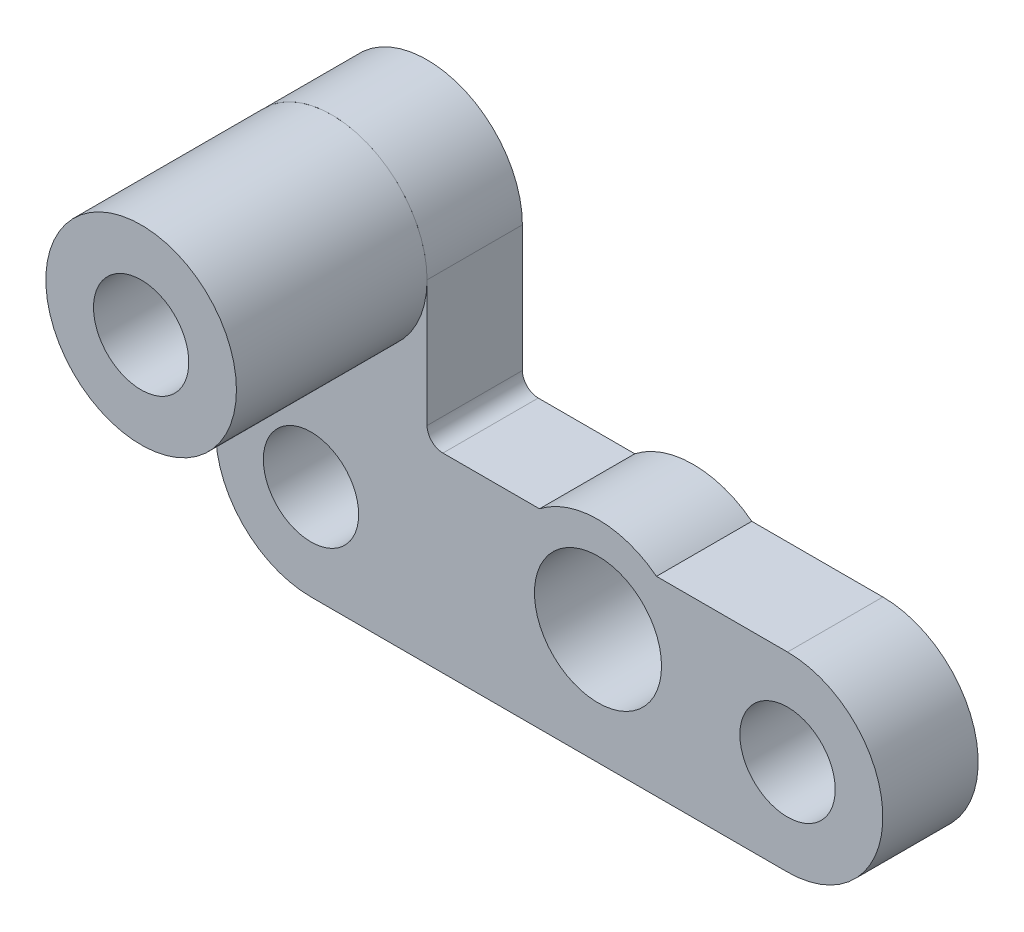
ISO-10303-21;
HEADER;
FILE_DESCRIPTION(('STEP AP214'),'2;1');
FILE_NAME('part.step','',(''),(''),'','','');
FILE_SCHEMA(('AUTOMOTIVE_DESIGN { 1 0 10303 214 1 1 1 1 }'));
ENDSEC;
DATA;
#1=APPLICATION_CONTEXT('core data for automotive mechanical design processes');
#2=APPLICATION_PROTOCOL_DEFINITION('international standard','automotive_design',2000,#1);
#3=PRODUCT_CONTEXT('',#1,'mechanical');
#4=PRODUCT('Part','Part','',(#3));
#5=PRODUCT_RELATED_PRODUCT_CATEGORY('part','',(#4));
#6=PRODUCT_DEFINITION_FORMATION('','',#4);
#7=PRODUCT_DEFINITION_CONTEXT('part definition',#1,'design');
#8=PRODUCT_DEFINITION('design','',#6,#7);
#9=PRODUCT_DEFINITION_SHAPE('','',#8);
#10=(LENGTH_UNIT() NAMED_UNIT(*) SI_UNIT(.MILLI.,.METRE.));
#11=(NAMED_UNIT(*) PLANE_ANGLE_UNIT() SI_UNIT($,.RADIAN.));
#12=(NAMED_UNIT(*) SI_UNIT($,.STERADIAN.) SOLID_ANGLE_UNIT());
#13=UNCERTAINTY_MEASURE_WITH_UNIT(LENGTH_MEASURE(1.E-05),#10,'distance_accuracy_value','');
#14=(GEOMETRIC_REPRESENTATION_CONTEXT(3) GLOBAL_UNCERTAINTY_ASSIGNED_CONTEXT((#13)) GLOBAL_UNIT_ASSIGNED_CONTEXT((#10,
#11,#12)) REPRESENTATION_CONTEXT('',''));
#15=CARTESIAN_POINT('',(0.,0.,0.));
#16=DIRECTION('',(0.,0.,1.));
#17=DIRECTION('',(1.,0.,0.));
#18=AXIS2_PLACEMENT_3D('',#15,#16,#17);
#19=CARTESIAN_POINT('',(-7.36899449850071,11.01,4.));
#20=DIRECTION('',(0.,0.,-1.));
#21=DIRECTION('',(-1.,0.,0.));
#22=AXIS2_PLACEMENT_3D('',#19,#20,#21);
#23=PLANE('',#22);
#24=CARTESIAN_POINT('',(0.,8.,4.));
#25=DIRECTION('',(0.,0.,-1.));
#26=DIRECTION('',(-1.,0.,0.));
#27=AXIS2_PLACEMENT_3D('',#24,#25,#26);
#28=CIRCLE('',#27,1.5);
#29=CARTESIAN_POINT('',(-1.5,8.,4.));
#30=VERTEX_POINT('',#29);
#31=EDGE_CURVE('E51',#30,#30,#28,.F.);
#32=ORIENTED_EDGE('',*,*,#31,.T.);
#33=EDGE_LOOP('',(#32));
#34=FACE_BOUND('',#33,.T.);
#35=CARTESIAN_POINT('',(0.,8.,4.));
#36=DIRECTION('',(0.,0.,1.));
#37=DIRECTION('',(1.,0.,0.));
#38=AXIS2_PLACEMENT_3D('',#35,#36,#37);
#39=CIRCLE('',#38,3.);
#40=CARTESIAN_POINT('',(3.,8.,4.));
#41=VERTEX_POINT('',#40);
#42=EDGE_CURVE('E55',#41,#41,#39,.T.);
#43=ORIENTED_EDGE('',*,*,#42,.F.);
#44=EDGE_LOOP('',(#43));
#45=FACE_BOUND('',#44,.T.);
#46=ADVANCED_FACE('F47',(#34,#45),#23,.T.);
#47=CARTESIAN_POINT('',(0.,0.,10.));
#48=DIRECTION('',(0.,0.,1.));
#49=DIRECTION('',(1.,0.,0.));
#50=AXIS2_PLACEMENT_3D('',#47,#48,#49);
#51=PLANE('',#50);
#52=CARTESIAN_POINT('',(0.,8.,10.));
#53=DIRECTION('',(0.,0.,-1.));
#54=DIRECTION('',(-1.,0.,0.));
#55=AXIS2_PLACEMENT_3D('',#52,#53,#54);
#56=CIRCLE('',#55,1.5);
#57=CARTESIAN_POINT('',(-1.5,8.,10.));
#58=VERTEX_POINT('',#57);
#59=EDGE_CURVE('E11',#58,#58,#56,.T.);
#60=ORIENTED_EDGE('',*,*,#59,.T.);
#61=EDGE_LOOP('',(#60));
#62=FACE_BOUND('',#61,.T.);
#63=CARTESIAN_POINT('',(0.,8.,10.));
#64=DIRECTION('',(0.,0.,1.));
#65=DIRECTION('',(1.,0.,0.));
#66=AXIS2_PLACEMENT_3D('',#63,#64,#65);
#67=CIRCLE('',#66,3.);
#68=CARTESIAN_POINT('',(3.,8.,10.));
#69=VERTEX_POINT('',#68);
#70=EDGE_CURVE('E60',#69,#69,#67,.T.);
#71=ORIENTED_EDGE('',*,*,#70,.T.);
#72=EDGE_LOOP('',(#71));
#73=FACE_BOUND('',#72,.T.);
#74=ADVANCED_FACE('F72',(#62,#73),#51,.T.);
#75=CARTESIAN_POINT('',(0.,8.,10.));
#76=DIRECTION('',(0.,0.,-1.));
#77=DIRECTION('',(-1.,0.,0.));
#78=AXIS2_PLACEMENT_3D('',#75,#76,#77);
#79=CYLINDRICAL_SURFACE('',#78,1.5);
#80=ORIENTED_EDGE('',*,*,#59,.F.);
#81=EDGE_LOOP('',(#80));
#82=FACE_BOUND('',#81,.T.);
#83=ORIENTED_EDGE('',*,*,#31,.F.);
#84=EDGE_LOOP('',(#83));
#85=FACE_BOUND('',#84,.T.);
#86=ADVANCED_FACE('F70',(#82,#85),#79,.F.);
#87=CARTESIAN_POINT('',(0.,8.,10.));
#88=DIRECTION('',(0.,0.,-1.));
#89=DIRECTION('',(-1.,0.,0.));
#90=AXIS2_PLACEMENT_3D('',#87,#88,#89);
#91=CYLINDRICAL_SURFACE('',#90,3.);
#92=ORIENTED_EDGE('',*,*,#70,.F.);
#93=EDGE_LOOP('',(#92));
#94=FACE_BOUND('',#93,.T.);
#95=ORIENTED_EDGE('',*,*,#42,.T.);
#96=EDGE_LOOP('',(#95));
#97=FACE_BOUND('',#96,.T.);
#98=ADVANCED_FACE('F49',(#94,#97),#91,.T.);
#99=CLOSED_SHELL('',(#46,#74,#86,#98));
#100=MANIFOLD_SOLID_BREP('B2',#99);
#101=CARTESIAN_POINT('',(-12.4143954820266,5.32179447841723,4.));
#102=DIRECTION('',(0.,0.,-1.));
#103=DIRECTION('',(-1.,0.,0.));
#104=AXIS2_PLACEMENT_3D('',#101,#102,#103);
#105=CYLINDRICAL_SURFACE('',#104,9.7);
#106=CARTESIAN_POINT('',(-12.4143954820266,5.32179447841723,1.));
#107=DIRECTION('',(0.,0.,1.));
#108=DIRECTION('',(1.,0.,0.));
#109=AXIS2_PLACEMENT_3D('',#106,#107,#108);
#110=CIRCLE('',#109,9.7);
#111=CARTESIAN_POINT('',(-2.93253436583307,7.36735302639777,1.));
#112=VERTEX_POINT('',#111);
#113=CARTESIAN_POINT('',(-3.43179265598205,1.66080465740765,1.));
#114=VERTEX_POINT('',#113);
#115=EDGE_CURVE('E224',#112,#114,#110,.F.);
#116=ORIENTED_EDGE('',*,*,#115,.T.);
#117=DIRECTION('',(0.,0.,-1.));
#118=VECTOR('',#117,1.);
#119=CARTESIAN_POINT('',(-3.43179265598205,1.66080465740765,4.));
#120=LINE('',#119,#118);
#121=CARTESIAN_POINT('',(-3.43179265598205,1.66080465740765,4.));
#122=VERTEX_POINT('',#121);
#123=EDGE_CURVE('E233',#122,#114,#120,.T.);
#124=ORIENTED_EDGE('',*,*,#123,.F.);
#125=CARTESIAN_POINT('',(-12.4143954820266,5.32179447841723,4.));
#126=DIRECTION('',(0.,0.,1.));
#127=DIRECTION('',(1.,0.,0.));
#128=AXIS2_PLACEMENT_3D('',#125,#126,#127);
#129=CIRCLE('',#128,9.7);
#130=CARTESIAN_POINT('',(-2.93253436583307,7.36735302639777,4.));
#131=VERTEX_POINT('',#130);
#132=EDGE_CURVE('E231',#131,#122,#129,.F.);
#133=ORIENTED_EDGE('',*,*,#132,.F.);
#134=DIRECTION('',(0.,0.,-1.));
#135=VECTOR('',#134,1.);
#136=CARTESIAN_POINT('',(-2.93253436583307,7.36735302639777,4.));
#137=LINE('',#136,#135);
#138=EDGE_CURVE('E236',#131,#112,#137,.T.);
#139=ORIENTED_EDGE('',*,*,#138,.T.);
#140=EDGE_LOOP('',(#116,#124,#133,#139));
#141=FACE_BOUND('',#140,.T.);
#142=ADVANCED_FACE('F112',(#141),#105,.F.);
#143=CARTESIAN_POINT('',(0.,-2.47146023568809,4.));
#144=DIRECTION('',(0.,1.,0.));
#145=DIRECTION('',(0.,0.,1.));
#146=AXIS2_PLACEMENT_3D('',#143,#144,#145);
#147=PLANE('',#146);
#148=DIRECTION('',(1.,0.,0.));
#149=VECTOR('',#148,1.);
#150=CARTESIAN_POINT('',(0.,-2.47146023568809,1.));
#151=LINE('',#150,#149);
#152=CARTESIAN_POINT('',(-0.653668070607438,-2.47146023568809,1.));
#153=VERTEX_POINT('',#152);
#154=CARTESIAN_POINT('',(14.3463319293926,-2.47146023568809,1.));
#155=VERTEX_POINT('',#154);
#156=EDGE_CURVE('E278',#153,#155,#151,.T.);
#157=ORIENTED_EDGE('',*,*,#156,.T.);
#158=DIRECTION('',(0.,0.,-1.));
#159=VECTOR('',#158,1.);
#160=CARTESIAN_POINT('',(14.3463319293926,-2.47146023568809,4.));
#161=LINE('',#160,#159);
#162=CARTESIAN_POINT('',(14.3463319293926,-2.47146023568809,4.));
#163=VERTEX_POINT('',#162);
#164=EDGE_CURVE('E243',#163,#155,#161,.T.);
#165=ORIENTED_EDGE('',*,*,#164,.F.);
#166=DIRECTION('',(1.,0.,0.));
#167=VECTOR('',#166,1.);
#168=CARTESIAN_POINT('',(0.,-2.47146023568809,4.));
#169=LINE('',#168,#167);
#170=CARTESIAN_POINT('',(-0.653668070607438,-2.47146023568809,4.));
#171=VERTEX_POINT('',#170);
#172=EDGE_CURVE('E223',#171,#163,#169,.T.);
#173=ORIENTED_EDGE('',*,*,#172,.F.);
#174=DIRECTION('',(0.,0.,-1.));
#175=VECTOR('',#174,1.);
#176=CARTESIAN_POINT('',(-0.653668070607438,-2.47146023568809,4.));
#177=LINE('',#176,#175);
#178=EDGE_CURVE('E215',#171,#153,#177,.T.);
#179=ORIENTED_EDGE('',*,*,#178,.T.);
#180=EDGE_LOOP('',(#157,#165,#173,#179));
#181=FACE_BOUND('',#180,.T.);
#182=ADVANCED_FACE('F314',(#181),#147,.F.);
#183=CARTESIAN_POINT('',(14.3463319293926,0.528539764311909,4.));
#184=DIRECTION('',(0.,0.,-1.));
#185=DIRECTION('',(-1.,0.,0.));
#186=AXIS2_PLACEMENT_3D('',#183,#184,#185);
#187=CYLINDRICAL_SURFACE('',#186,3.);
#188=CARTESIAN_POINT('',(14.3463319293926,0.528539764311909,1.));
#189=DIRECTION('',(0.,0.,1.));
#190=DIRECTION('',(1.,0.,0.));
#191=AXIS2_PLACEMENT_3D('',#188,#189,#190);
#192=CIRCLE('',#191,3.);
#193=CARTESIAN_POINT('',(14.3463319293926,3.52853976431191,1.));
#194=VERTEX_POINT('',#193);
#195=EDGE_CURVE('E280',#155,#194,#192,.T.);
#196=ORIENTED_EDGE('',*,*,#195,.T.);
#197=DIRECTION('',(0.,0.,-1.));
#198=VECTOR('',#197,1.);
#199=CARTESIAN_POINT('',(14.3463319293926,3.52853976431191,4.));
#200=LINE('',#199,#198);
#201=CARTESIAN_POINT('',(14.3463319293926,3.52853976431191,4.));
#202=VERTEX_POINT('',#201);
#203=EDGE_CURVE('E241',#202,#194,#200,.T.);
#204=ORIENTED_EDGE('',*,*,#203,.F.);
#205=CARTESIAN_POINT('',(14.3463319293926,0.528539764311909,4.));
#206=DIRECTION('',(0.,0.,1.));
#207=DIRECTION('',(1.,0.,0.));
#208=AXIS2_PLACEMENT_3D('',#205,#206,#207);
#209=CIRCLE('',#208,3.);
#210=EDGE_CURVE('E206',#163,#202,#209,.T.);
#211=ORIENTED_EDGE('',*,*,#210,.F.);
#212=ORIENTED_EDGE('',*,*,#164,.T.);
#213=EDGE_LOOP('',(#196,#204,#211,#212));
#214=FACE_BOUND('',#213,.T.);
#215=ADVANCED_FACE('F320',(#214),#187,.T.);
#216=CARTESIAN_POINT('',(8.3796485147358,1.15995803238776,4.));
#217=DIRECTION('',(0.,0.,-1.));
#218=DIRECTION('',(-1.,0.,0.));
#219=AXIS2_PLACEMENT_3D('',#216,#217,#218);
#220=CYLINDRICAL_SURFACE('',#219,3.);
#221=CARTESIAN_POINT('',(8.3796485147358,1.15995803238776,1.));
#222=DIRECTION('',(0.,0.,1.));
#223=DIRECTION('',(1.,0.,0.));
#224=AXIS2_PLACEMENT_3D('',#221,#222,#223);
#225=CIRCLE('',#224,3.);
#226=CARTESIAN_POINT('',(10.2207950540409,3.52853976431191,1.));
#227=VERTEX_POINT('',#226);
#228=CARTESIAN_POINT('',(6.53850197543069,3.52853976431191,1.));
#229=VERTEX_POINT('',#228);
#230=EDGE_CURVE('E212',#227,#229,#225,.T.);
#231=ORIENTED_EDGE('',*,*,#230,.T.);
#232=DIRECTION('',(0.,0.,-1.));
#233=VECTOR('',#232,1.);
#234=CARTESIAN_POINT('',(6.53850197543069,3.52853976431191,4.));
#235=LINE('',#234,#233);
#236=CARTESIAN_POINT('',(6.53850197543069,3.52853976431191,4.));
#237=VERTEX_POINT('',#236);
#238=EDGE_CURVE('E198',#237,#229,#235,.T.);
#239=ORIENTED_EDGE('',*,*,#238,.F.);
#240=CARTESIAN_POINT('',(8.3796485147358,1.15995803238776,4.));
#241=DIRECTION('',(0.,0.,1.));
#242=DIRECTION('',(1.,0.,0.));
#243=AXIS2_PLACEMENT_3D('',#240,#241,#242);
#244=CIRCLE('',#243,3.);
#245=CARTESIAN_POINT('',(10.2207950540409,3.52853976431191,4.));
#246=VERTEX_POINT('',#245);
#247=EDGE_CURVE('E204',#246,#237,#244,.T.);
#248=ORIENTED_EDGE('',*,*,#247,.F.);
#249=DIRECTION('',(0.,0.,-1.));
#250=VECTOR('',#249,1.);
#251=CARTESIAN_POINT('',(10.2207950540409,3.52853976431191,4.));
#252=LINE('',#251,#250);
#253=EDGE_CURVE('E186',#246,#227,#252,.T.);
#254=ORIENTED_EDGE('',*,*,#253,.T.);
#255=EDGE_LOOP('',(#231,#239,#248,#254));
#256=FACE_BOUND('',#255,.T.);
#257=ADVANCED_FACE('F210',(#256),#220,.T.);
#258=CARTESIAN_POINT('',(3.,0.,4.));
#259=DIRECTION('',(1.,0.,0.));
#260=DIRECTION('',(0.,1.,0.));
#261=AXIS2_PLACEMENT_3D('',#258,#259,#260);
#262=PLANE('',#261);
#263=DIRECTION('',(0.,-1.,0.));
#264=VECTOR('',#263,1.);
#265=CARTESIAN_POINT('',(3.,0.,4.));
#266=LINE('',#265,#264);
#267=CARTESIAN_POINT('',(3.,8.,4.));
#268=VERTEX_POINT('',#267);
#269=CARTESIAN_POINT('',(3.,4.02853976431191,4.));
#270=VERTEX_POINT('',#269);
#271=EDGE_CURVE('E228',#268,#270,#266,.T.);
#272=ORIENTED_EDGE('',*,*,#271,.T.);
#273=DIRECTION('',(0.,0.,-1.));
#274=VECTOR('',#273,1.);
#275=CARTESIAN_POINT('',(3.,4.02853976431191,4.));
#276=LINE('',#275,#274);
#277=CARTESIAN_POINT('',(3.,4.02853976431191,1.));
#278=VERTEX_POINT('',#277);
#279=EDGE_CURVE('E257',#270,#278,#276,.T.);
#280=ORIENTED_EDGE('',*,*,#279,.T.);
#281=DIRECTION('',(0.,-1.,0.));
#282=VECTOR('',#281,1.);
#283=CARTESIAN_POINT('',(3.,0.,1.));
#284=LINE('',#283,#282);
#285=CARTESIAN_POINT('',(3.,8.,1.));
#286=VERTEX_POINT('',#285);
#287=EDGE_CURVE('E275',#286,#278,#284,.T.);
#288=ORIENTED_EDGE('',*,*,#287,.F.);
#289=DIRECTION('',(0.,0.,-1.));
#290=VECTOR('',#289,1.);
#291=CARTESIAN_POINT('',(3.,8.,4.));
#292=LINE('',#291,#290);
#293=EDGE_CURVE('E239',#268,#286,#292,.T.);
#294=ORIENTED_EDGE('',*,*,#293,.F.);
#295=EDGE_LOOP('',(#272,#280,#288,#294));
#296=FACE_BOUND('',#295,.T.);
#297=ADVANCED_FACE('F324',(#296),#262,.T.);
#298=CARTESIAN_POINT('',(0.,0.,1.));
#299=DIRECTION('',(0.,0.,1.));
#300=DIRECTION('',(1.,0.,0.));
#301=AXIS2_PLACEMENT_3D('',#298,#299,#300);
#302=PLANE('',#301);
#303=CARTESIAN_POINT('',(-0.653668070607438,0.528539764311908,1.));
#304=DIRECTION('',(0.,0.,-1.));
#305=DIRECTION('',(-1.,0.,0.));
#306=AXIS2_PLACEMENT_3D('',#303,#304,#305);
#307=CIRCLE('',#306,1.5);
#308=CARTESIAN_POINT('',(-2.15366807060744,0.528539764311908,1.));
#309=VERTEX_POINT('',#308);
#310=EDGE_CURVE('E265',#309,#309,#307,.T.);
#311=ORIENTED_EDGE('',*,*,#310,.F.);
#312=EDGE_LOOP('',(#311));
#313=FACE_BOUND('',#312,.T.);
#314=CARTESIAN_POINT('',(0.,8.,1.));
#315=DIRECTION('',(0.,0.,-1.));
#316=DIRECTION('',(-1.,0.,0.));
#317=AXIS2_PLACEMENT_3D('',#314,#315,#316);
#318=CIRCLE('',#317,1.5);
#319=CARTESIAN_POINT('',(-1.5,8.,1.));
#320=VERTEX_POINT('',#319);
#321=EDGE_CURVE('E268',#320,#320,#318,.T.);
#322=ORIENTED_EDGE('',*,*,#321,.F.);
#323=EDGE_LOOP('',(#322));
#324=FACE_BOUND('',#323,.T.);
#325=CARTESIAN_POINT('',(14.3463319293926,0.528539764311909,1.));
#326=DIRECTION('',(0.,0.,-1.));
#327=DIRECTION('',(-1.,0.,0.));
#328=AXIS2_PLACEMENT_3D('',#325,#326,#327);
#329=CIRCLE('',#328,1.5);
#330=CARTESIAN_POINT('',(12.8463319293926,0.528539764311909,1.));
#331=VERTEX_POINT('',#330);
#332=EDGE_CURVE('E256',#331,#331,#329,.T.);
#333=ORIENTED_EDGE('',*,*,#332,.F.);
#334=EDGE_LOOP('',(#333));
#335=FACE_BOUND('',#334,.T.);
#336=CARTESIAN_POINT('',(0.,8.,1.));
#337=DIRECTION('',(0.,0.,1.));
#338=DIRECTION('',(1.,0.,0.));
#339=AXIS2_PLACEMENT_3D('',#336,#337,#338);
#340=CIRCLE('',#339,3.);
#341=EDGE_CURVE('E197',#286,#112,#340,.T.);
#342=ORIENTED_EDGE('',*,*,#341,.F.);
#343=ORIENTED_EDGE('',*,*,#287,.T.);
#344=CARTESIAN_POINT('',(3.5,4.02853976431191,1.));
#345=DIRECTION('',(0.,0.,1.));
#346=DIRECTION('',(1.,0.,0.));
#347=AXIS2_PLACEMENT_3D('',#344,#345,#346);
#348=CIRCLE('',#347,0.5);
#349=CARTESIAN_POINT('',(3.5,3.52853976431191,1.));
#350=VERTEX_POINT('',#349);
#351=EDGE_CURVE('E262',#278,#350,#348,.T.);
#352=ORIENTED_EDGE('',*,*,#351,.T.);
#353=DIRECTION('',(-1.,0.,0.));
#354=VECTOR('',#353,1.);
#355=CARTESIAN_POINT('',(0.,3.52853976431191,1.));
#356=LINE('',#355,#354);
#357=EDGE_CURVE('E282',#229,#350,#356,.T.);
#358=ORIENTED_EDGE('',*,*,#357,.F.);
#359=ORIENTED_EDGE('',*,*,#230,.F.);
#360=DIRECTION('',(-1.,0.,0.));
#361=VECTOR('',#360,1.);
#362=CARTESIAN_POINT('',(0.,3.52853976431191,1.));
#363=LINE('',#362,#361);
#364=EDGE_CURVE('E192',#194,#227,#363,.T.);
#365=ORIENTED_EDGE('',*,*,#364,.F.);
#366=ORIENTED_EDGE('',*,*,#195,.F.);
#367=ORIENTED_EDGE('',*,*,#156,.F.);
#368=CARTESIAN_POINT('',(-0.653668070607438,0.528539764311908,1.));
#369=DIRECTION('',(0.,0.,1.));
#370=DIRECTION('',(1.,0.,0.));
#371=AXIS2_PLACEMENT_3D('',#368,#369,#370);
#372=CIRCLE('',#371,3.);
#373=EDGE_CURVE('E251',#114,#153,#372,.T.);
#374=ORIENTED_EDGE('',*,*,#373,.F.);
#375=ORIENTED_EDGE('',*,*,#115,.F.);
#376=EDGE_LOOP('',(#342,#343,#352,#358,#359,#365,#366,#367,#374,#375));
#377=FACE_BOUND('',#376,.T.);
#378=CARTESIAN_POINT('',(8.3796485147358,1.15995803238776,1.));
#379=DIRECTION('',(0.,0.,1.));
#380=DIRECTION('',(1.,0.,0.));
#381=AXIS2_PLACEMENT_3D('',#378,#379,#380);
#382=CIRCLE('',#381,2.);
#383=CARTESIAN_POINT('',(10.3796485147358,1.15995803238776,1.));
#384=VERTEX_POINT('',#383);
#385=EDGE_CURVE('E252',#384,#384,#382,.T.);
#386=ORIENTED_EDGE('',*,*,#385,.T.);
#387=EDGE_LOOP('',(#386));
#388=FACE_BOUND('',#387,.T.);
#389=ADVANCED_FACE('F114',(#313,#324,#335,#377,#388),#302,.F.);
#390=CARTESIAN_POINT('',(0.,3.52853976431191,4.));
#391=DIRECTION('',(0.,-1.,0.));
#392=DIRECTION('',(0.,0.,-1.));
#393=AXIS2_PLACEMENT_3D('',#390,#391,#392);
#394=PLANE('',#393);
#395=ORIENTED_EDGE('',*,*,#357,.T.);
#396=DIRECTION('',(0.,0.,-1.));
#397=VECTOR('',#396,1.);
#398=CARTESIAN_POINT('',(3.5,3.52853976431191,4.));
#399=LINE('',#398,#397);
#400=CARTESIAN_POINT('',(3.5,3.52853976431191,4.));
#401=VERTEX_POINT('',#400);
#402=EDGE_CURVE('E260',#350,#401,#399,.F.);
#403=ORIENTED_EDGE('',*,*,#402,.T.);
#404=DIRECTION('',(-1.,0.,0.));
#405=VECTOR('',#404,1.);
#406=CARTESIAN_POINT('',(0.,3.52853976431191,4.));
#407=LINE('',#406,#405);
#408=EDGE_CURVE('E208',#237,#401,#407,.T.);
#409=ORIENTED_EDGE('',*,*,#408,.F.);
#410=ORIENTED_EDGE('',*,*,#238,.T.);
#411=EDGE_LOOP('',(#395,#403,#409,#410));
#412=FACE_BOUND('',#411,.T.);
#413=ADVANCED_FACE('F328',(#412),#394,.F.);
#414=CARTESIAN_POINT('',(3.5,4.02853976431191,4.));
#415=DIRECTION('',(0.,0.,-1.));
#416=DIRECTION('',(-1.,0.,0.));
#417=AXIS2_PLACEMENT_3D('',#414,#415,#416);
#418=CYLINDRICAL_SURFACE('',#417,0.5);
#419=CARTESIAN_POINT('',(3.5,4.02853976431191,4.));
#420=DIRECTION('',(0.,0.,1.));
#421=DIRECTION('',(1.,0.,0.));
#422=AXIS2_PLACEMENT_3D('',#419,#420,#421);
#423=CIRCLE('',#422,0.5);
#424=EDGE_CURVE('E263',#401,#270,#423,.F.);
#425=ORIENTED_EDGE('',*,*,#424,.F.);
#426=ORIENTED_EDGE('',*,*,#402,.F.);
#427=ORIENTED_EDGE('',*,*,#351,.F.);
#428=ORIENTED_EDGE('',*,*,#279,.F.);
#429=EDGE_LOOP('',(#425,#426,#427,#428));
#430=FACE_BOUND('',#429,.T.);
#431=ADVANCED_FACE('F331',(#430),#418,.F.);
#432=CARTESIAN_POINT('',(-0.653668070607438,0.528539764311908,10.001));
#433=DIRECTION('',(0.,0.,-1.));
#434=DIRECTION('',(-1.,0.,0.));
#435=AXIS2_PLACEMENT_3D('',#432,#433,#434);
#436=CYLINDRICAL_SURFACE('',#435,1.5);
#437=CARTESIAN_POINT('',(-0.653668070607438,0.528539764311908,4.));
#438=DIRECTION('',(0.,0.,1.));
#439=DIRECTION('',(1.,0.,0.));
#440=AXIS2_PLACEMENT_3D('',#437,#438,#439);
#441=CIRCLE('',#440,1.5);
#442=CARTESIAN_POINT('',(0.846331929392562,0.528539764311908,4.));
#443=VERTEX_POINT('',#442);
#444=EDGE_CURVE('E218',#443,#443,#441,.F.);
#445=ORIENTED_EDGE('',*,*,#444,.F.);
#446=EDGE_LOOP('',(#445));
#447=FACE_BOUND('',#446,.T.);
#448=ORIENTED_EDGE('',*,*,#310,.T.);
#449=EDGE_LOOP('',(#448));
#450=FACE_BOUND('',#449,.T.);
#451=ADVANCED_FACE('F342',(#447,#450),#436,.F.);
#452=CARTESIAN_POINT('',(0.,8.,10.));
#453=DIRECTION('',(0.,0.,-1.));
#454=DIRECTION('',(-1.,0.,0.));
#455=AXIS2_PLACEMENT_3D('',#452,#453,#454);
#456=CYLINDRICAL_SURFACE('',#455,1.5);
#457=CARTESIAN_POINT('',(0.,8.,4.));
#458=DIRECTION('',(0.,0.,-1.));
#459=DIRECTION('',(-1.,0.,0.));
#460=AXIS2_PLACEMENT_3D('',#457,#458,#459);
#461=CIRCLE('',#460,1.5);
#462=CARTESIAN_POINT('',(-1.5,8.,4.));
#463=VERTEX_POINT('',#462);
#464=EDGE_CURVE('E120',#463,#463,#461,.F.);
#465=ORIENTED_EDGE('',*,*,#464,.T.);
#466=EDGE_LOOP('',(#465));
#467=FACE_BOUND('',#466,.T.);
#468=ORIENTED_EDGE('',*,*,#321,.T.);
#469=EDGE_LOOP('',(#468));
#470=FACE_BOUND('',#469,.T.);
#471=ADVANCED_FACE('F293',(#467,#470),#456,.F.);
#472=CARTESIAN_POINT('',(14.3463319293926,0.528539764311909,10.));
#473=DIRECTION('',(0.,0.,-1.));
#474=DIRECTION('',(-1.,0.,0.));
#475=AXIS2_PLACEMENT_3D('',#472,#473,#474);
#476=CYLINDRICAL_SURFACE('',#475,1.5);
#477=CARTESIAN_POINT('',(14.3463319293926,0.528539764311909,4.));
#478=DIRECTION('',(0.,0.,1.));
#479=DIRECTION('',(1.,0.,0.));
#480=AXIS2_PLACEMENT_3D('',#477,#478,#479);
#481=CIRCLE('',#480,1.5);
#482=CARTESIAN_POINT('',(15.8463319293926,0.528539764311909,4.));
#483=VERTEX_POINT('',#482);
#484=EDGE_CURVE('E253',#483,#483,#481,.T.);
#485=ORIENTED_EDGE('',*,*,#484,.T.);
#486=EDGE_LOOP('',(#485));
#487=FACE_BOUND('',#486,.T.);
#488=ORIENTED_EDGE('',*,*,#332,.T.);
#489=EDGE_LOOP('',(#488));
#490=FACE_BOUND('',#489,.T.);
#491=ADVANCED_FACE('F335',(#487,#490),#476,.F.);
#492=CARTESIAN_POINT('',(0.,3.52853976431191,4.));
#493=DIRECTION('',(0.,-1.,0.));
#494=DIRECTION('',(0.,0.,-1.));
#495=AXIS2_PLACEMENT_3D('',#492,#493,#494);
#496=PLANE('',#495);
#497=ORIENTED_EDGE('',*,*,#364,.T.);
#498=ORIENTED_EDGE('',*,*,#253,.F.);
#499=DIRECTION('',(-1.,0.,0.));
#500=VECTOR('',#499,1.);
#501=CARTESIAN_POINT('',(0.,3.52853976431191,4.));
#502=LINE('',#501,#500);
#503=EDGE_CURVE('E190',#202,#246,#502,.T.);
#504=ORIENTED_EDGE('',*,*,#503,.F.);
#505=ORIENTED_EDGE('',*,*,#203,.T.);
#506=EDGE_LOOP('',(#497,#498,#504,#505));
#507=FACE_BOUND('',#506,.T.);
#508=ADVANCED_FACE('F188',(#507),#496,.F.);
#509=CARTESIAN_POINT('',(8.3796485147358,1.15995803238776,4.));
#510=DIRECTION('',(0.,0.,-1.));
#511=DIRECTION('',(-1.,0.,0.));
#512=AXIS2_PLACEMENT_3D('',#509,#510,#511);
#513=CYLINDRICAL_SURFACE('',#512,2.);
#514=CARTESIAN_POINT('',(8.3796485147358,1.15995803238776,4.));
#515=DIRECTION('',(0.,0.,1.));
#516=DIRECTION('',(1.,0.,0.));
#517=AXIS2_PLACEMENT_3D('',#514,#515,#516);
#518=CIRCLE('',#517,2.);
#519=CARTESIAN_POINT('',(10.3796485147358,1.15995803238776,4.));
#520=VERTEX_POINT('',#519);
#521=EDGE_CURVE('E248',#520,#520,#518,.T.);
#522=ORIENTED_EDGE('',*,*,#521,.T.);
#523=EDGE_LOOP('',(#522));
#524=FACE_BOUND('',#523,.T.);
#525=ORIENTED_EDGE('',*,*,#385,.F.);
#526=EDGE_LOOP('',(#525));
#527=FACE_BOUND('',#526,.T.);
#528=ADVANCED_FACE('F306',(#524,#527),#513,.F.);
#529=CARTESIAN_POINT('',(-0.653668070607438,0.528539764311908,4.));
#530=DIRECTION('',(0.,0.,-1.));
#531=DIRECTION('',(-1.,0.,0.));
#532=AXIS2_PLACEMENT_3D('',#529,#530,#531);
#533=CYLINDRICAL_SURFACE('',#532,3.);
#534=ORIENTED_EDGE('',*,*,#373,.T.);
#535=ORIENTED_EDGE('',*,*,#178,.F.);
#536=CARTESIAN_POINT('',(-0.653668070607438,0.528539764311908,4.));
#537=DIRECTION('',(0.,0.,1.));
#538=DIRECTION('',(1.,0.,0.));
#539=AXIS2_PLACEMENT_3D('',#536,#537,#538);
#540=CIRCLE('',#539,3.);
#541=EDGE_CURVE('E220',#122,#171,#540,.T.);
#542=ORIENTED_EDGE('',*,*,#541,.F.);
#543=ORIENTED_EDGE('',*,*,#123,.T.);
#544=EDGE_LOOP('',(#534,#535,#542,#543));
#545=FACE_BOUND('',#544,.T.);
#546=ADVANCED_FACE('F298',(#545),#533,.T.);
#547=CARTESIAN_POINT('',(0.,0.,4.));
#548=DIRECTION('',(0.,0.,1.));
#549=DIRECTION('',(1.,0.,0.));
#550=AXIS2_PLACEMENT_3D('',#547,#548,#549);
#551=PLANE('',#550);
#552=ORIENTED_EDGE('',*,*,#444,.T.);
#553=EDGE_LOOP('',(#552));
#554=FACE_BOUND('',#553,.T.);
#555=ORIENTED_EDGE('',*,*,#484,.F.);
#556=EDGE_LOOP('',(#555));
#557=FACE_BOUND('',#556,.T.);
#558=ORIENTED_EDGE('',*,*,#247,.T.);
#559=ORIENTED_EDGE('',*,*,#408,.T.);
#560=ORIENTED_EDGE('',*,*,#424,.T.);
#561=ORIENTED_EDGE('',*,*,#271,.F.);
#562=CARTESIAN_POINT('',(0.,8.,4.));
#563=DIRECTION('',(0.,0.,-1.));
#564=DIRECTION('',(-1.,0.,0.));
#565=AXIS2_PLACEMENT_3D('',#562,#563,#564);
#566=CIRCLE('',#565,3.);
#567=EDGE_CURVE('E45',#131,#268,#566,.T.);
#568=ORIENTED_EDGE('',*,*,#567,.F.);
#569=ORIENTED_EDGE('',*,*,#132,.T.);
#570=ORIENTED_EDGE('',*,*,#541,.T.);
#571=ORIENTED_EDGE('',*,*,#172,.T.);
#572=ORIENTED_EDGE('',*,*,#210,.T.);
#573=ORIENTED_EDGE('',*,*,#503,.T.);
#574=EDGE_LOOP('',(#558,#559,#560,#561,#568,#569,#570,#571,#572,#573));
#575=FACE_BOUND('',#574,.T.);
#576=ORIENTED_EDGE('',*,*,#521,.F.);
#577=EDGE_LOOP('',(#576));
#578=FACE_BOUND('',#577,.T.);
#579=ORIENTED_EDGE('',*,*,#464,.F.);
#580=EDGE_LOOP('',(#579));
#581=FACE_BOUND('',#580,.T.);
#582=ADVANCED_FACE('F201',(#554,#557,#575,#578,#581),#551,.T.);
#583=CARTESIAN_POINT('',(0.,8.,10.));
#584=DIRECTION('',(0.,0.,-1.));
#585=DIRECTION('',(-1.,0.,0.));
#586=AXIS2_PLACEMENT_3D('',#583,#584,#585);
#587=CYLINDRICAL_SURFACE('',#586,3.);
#588=ORIENTED_EDGE('',*,*,#138,.F.);
#589=ORIENTED_EDGE('',*,*,#567,.T.);
#590=ORIENTED_EDGE('',*,*,#293,.T.);
#591=ORIENTED_EDGE('',*,*,#341,.T.);
#592=EDGE_LOOP('',(#588,#589,#590,#591));
#593=FACE_BOUND('',#592,.T.);
#594=ADVANCED_FACE('F297',(#593),#587,.T.);
#595=CLOSED_SHELL('',(#142,#182,#215,#257,#297,#389,#413,#431,#451,#471,#491,#508,#528,#546,
#582,#594));
#596=MANIFOLD_SOLID_BREP('B6',#595);
#597=ADVANCED_BREP_SHAPE_REPRESENTATION('',(#18,#100,#596),#14);
#598=SHAPE_DEFINITION_REPRESENTATION(#9,#597);
ENDSEC;
END-ISO-10303-21;
